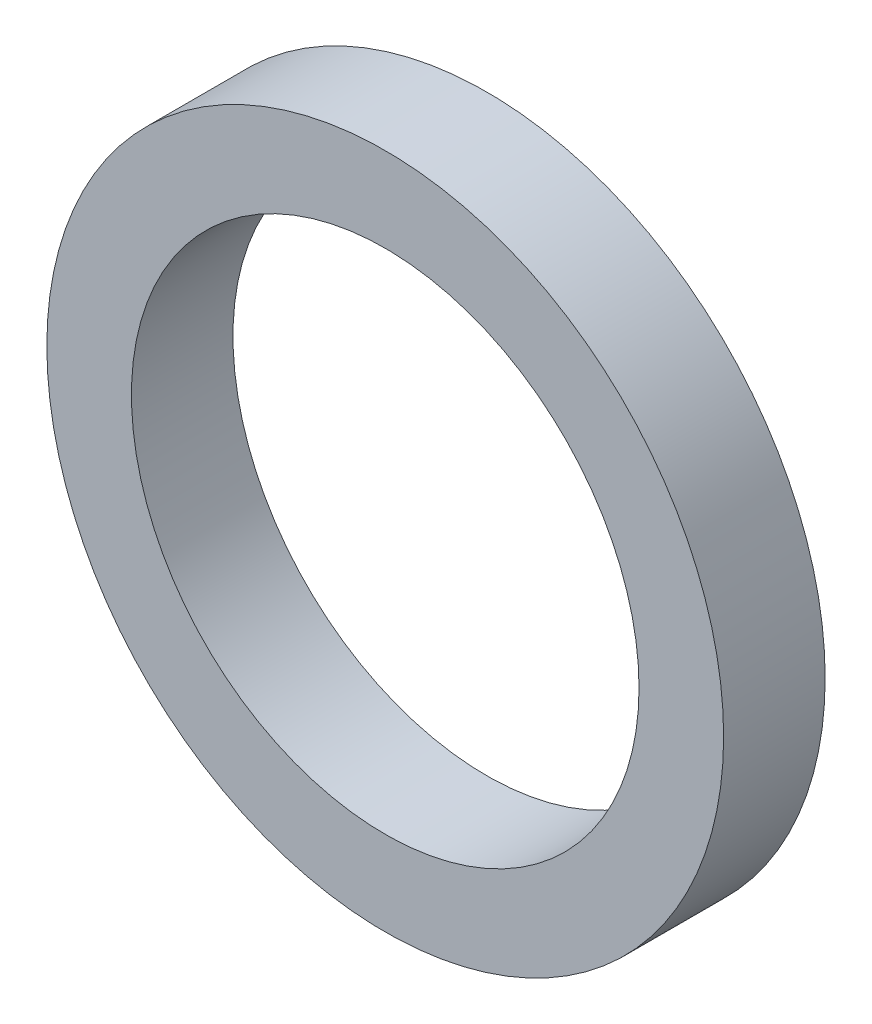
ISO-10303-21;
HEADER;
FILE_DESCRIPTION(('STEP AP214'),'2;1');
FILE_NAME('part.step','',(''),(''),'','','');
FILE_SCHEMA(('AUTOMOTIVE_DESIGN { 1 0 10303 214 1 1 1 1 }'));
ENDSEC;
DATA;
#1=APPLICATION_CONTEXT('core data for automotive mechanical design processes');
#2=APPLICATION_PROTOCOL_DEFINITION('international standard','automotive_design',2000,#1);
#3=PRODUCT_CONTEXT('',#1,'mechanical');
#4=PRODUCT('Part','Part','',(#3));
#5=PRODUCT_RELATED_PRODUCT_CATEGORY('part','',(#4));
#6=PRODUCT_DEFINITION_FORMATION('','',#4);
#7=PRODUCT_DEFINITION_CONTEXT('part definition',#1,'design');
#8=PRODUCT_DEFINITION('design','',#6,#7);
#9=PRODUCT_DEFINITION_SHAPE('','',#8);
#10=(LENGTH_UNIT() NAMED_UNIT(*) SI_UNIT(.MILLI.,.METRE.));
#11=(NAMED_UNIT(*) PLANE_ANGLE_UNIT() SI_UNIT($,.RADIAN.));
#12=(NAMED_UNIT(*) SI_UNIT($,.STERADIAN.) SOLID_ANGLE_UNIT());
#13=UNCERTAINTY_MEASURE_WITH_UNIT(LENGTH_MEASURE(1.E-05),#10,'distance_accuracy_value','');
#14=(GEOMETRIC_REPRESENTATION_CONTEXT(3) GLOBAL_UNCERTAINTY_ASSIGNED_CONTEXT((#13)) GLOBAL_UNIT_ASSIGNED_CONTEXT((#10,
#11,#12)) REPRESENTATION_CONTEXT('',''));
#15=CARTESIAN_POINT('',(0.,0.,0.));
#16=DIRECTION('',(0.,0.,1.));
#17=DIRECTION('',(1.,0.,0.));
#18=AXIS2_PLACEMENT_3D('',#15,#16,#17);
#19=CARTESIAN_POINT('',(0.,0.,6.));
#20=DIRECTION('',(0.,0.,1.));
#21=DIRECTION('',(1.,0.,0.));
#22=AXIS2_PLACEMENT_3D('',#19,#20,#21);
#23=PLANE('',#22);
#24=CARTESIAN_POINT('',(0.,0.,6.));
#25=DIRECTION('',(0.,0.,1.));
#26=DIRECTION('',(1.,0.,0.));
#27=AXIS2_PLACEMENT_3D('',#24,#25,#26);
#28=CIRCLE('',#27,20.);
#29=CARTESIAN_POINT('',(20.,0.,6.));
#30=VERTEX_POINT('',#29);
#31=EDGE_CURVE('E10',#30,#30,#28,.T.);
#32=ORIENTED_EDGE('',*,*,#31,.T.);
#33=EDGE_LOOP('',(#32));
#34=FACE_BOUND('',#33,.T.);
#35=CARTESIAN_POINT('',(0.,0.,6.));
#36=DIRECTION('',(0.,0.,1.));
#37=DIRECTION('',(1.,0.,0.));
#38=AXIS2_PLACEMENT_3D('',#35,#36,#37);
#39=CIRCLE('',#38,15.);
#40=CARTESIAN_POINT('',(15.,0.,6.));
#41=VERTEX_POINT('',#40);
#42=EDGE_CURVE('E50',#41,#41,#39,.T.);
#43=ORIENTED_EDGE('',*,*,#42,.F.);
#44=EDGE_LOOP('',(#43));
#45=FACE_BOUND('',#44,.T.);
#46=ADVANCED_FACE('F39',(#34,#45),#23,.T.);
#47=CARTESIAN_POINT('',(0.,0.,0.));
#48=DIRECTION('',(0.,0.,1.));
#49=DIRECTION('',(1.,0.,0.));
#50=AXIS2_PLACEMENT_3D('',#47,#48,#49);
#51=PLANE('',#50);
#52=CARTESIAN_POINT('',(0.,0.,0.));
#53=DIRECTION('',(0.,0.,1.));
#54=DIRECTION('',(1.,0.,0.));
#55=AXIS2_PLACEMENT_3D('',#52,#53,#54);
#56=CIRCLE('',#55,20.);
#57=CARTESIAN_POINT('',(20.,0.,0.));
#58=VERTEX_POINT('',#57);
#59=EDGE_CURVE('E43',#58,#58,#56,.T.);
#60=ORIENTED_EDGE('',*,*,#59,.F.);
#61=EDGE_LOOP('',(#60));
#62=FACE_BOUND('',#61,.T.);
#63=CARTESIAN_POINT('',(0.,0.,0.));
#64=DIRECTION('',(0.,0.,1.));
#65=DIRECTION('',(1.,0.,0.));
#66=AXIS2_PLACEMENT_3D('',#63,#64,#65);
#67=CIRCLE('',#66,15.);
#68=CARTESIAN_POINT('',(15.,0.,0.));
#69=VERTEX_POINT('',#68);
#70=EDGE_CURVE('E52',#69,#69,#67,.T.);
#71=ORIENTED_EDGE('',*,*,#70,.T.);
#72=EDGE_LOOP('',(#71));
#73=FACE_BOUND('',#72,.T.);
#74=ADVANCED_FACE('F62',(#62,#73),#51,.F.);
#75=CARTESIAN_POINT('',(0.,0.,6.));
#76=DIRECTION('',(0.,0.,-1.));
#77=DIRECTION('',(-1.,0.,0.));
#78=AXIS2_PLACEMENT_3D('',#75,#76,#77);
#79=CYLINDRICAL_SURFACE('',#78,20.);
#80=ORIENTED_EDGE('',*,*,#31,.F.);
#81=EDGE_LOOP('',(#80));
#82=FACE_BOUND('',#81,.T.);
#83=ORIENTED_EDGE('',*,*,#59,.T.);
#84=EDGE_LOOP('',(#83));
#85=FACE_BOUND('',#84,.T.);
#86=ADVANCED_FACE('F41',(#82,#85),#79,.T.);
#87=CARTESIAN_POINT('',(0.,0.,6.));
#88=DIRECTION('',(0.,0.,-1.));
#89=DIRECTION('',(-1.,0.,0.));
#90=AXIS2_PLACEMENT_3D('',#87,#88,#89);
#91=CYLINDRICAL_SURFACE('',#90,15.);
#92=ORIENTED_EDGE('',*,*,#42,.T.);
#93=EDGE_LOOP('',(#92));
#94=FACE_BOUND('',#93,.T.);
#95=ORIENTED_EDGE('',*,*,#70,.F.);
#96=EDGE_LOOP('',(#95));
#97=FACE_BOUND('',#96,.T.);
#98=ADVANCED_FACE('F58',(#94,#97),#91,.F.);
#99=CLOSED_SHELL('',(#46,#74,#86,#98));
#100=MANIFOLD_SOLID_BREP('B2',#99);
#101=ADVANCED_BREP_SHAPE_REPRESENTATION('',(#18,#100),#14);
#102=SHAPE_DEFINITION_REPRESENTATION(#9,#101);
ENDSEC;
END-ISO-10303-21;
